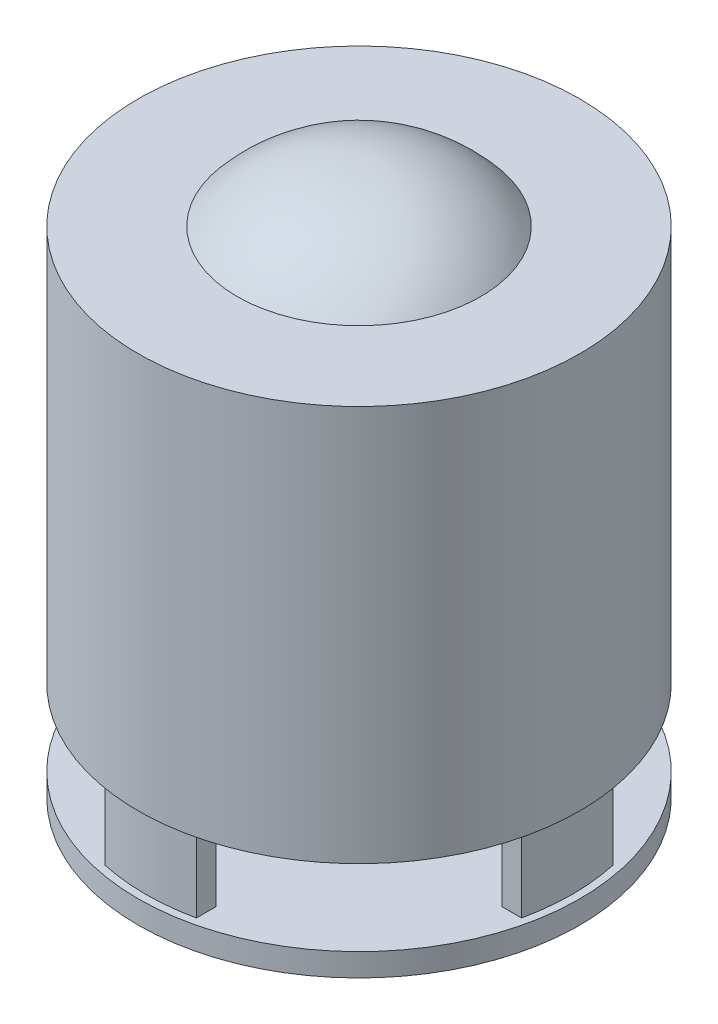
ISO-10303-21;
HEADER;
FILE_DESCRIPTION(('STEP AP214'),'2;1');
FILE_NAME('part.step','',(''),(''),'','','');
FILE_SCHEMA(('AUTOMOTIVE_DESIGN { 1 0 10303 214 1 1 1 1 }'));
ENDSEC;
DATA;
#1=APPLICATION_CONTEXT('core data for automotive mechanical design processes');
#2=APPLICATION_PROTOCOL_DEFINITION('international standard','automotive_design',2000,#1);
#3=PRODUCT_CONTEXT('',#1,'mechanical');
#4=PRODUCT('Part','Part','',(#3));
#5=PRODUCT_RELATED_PRODUCT_CATEGORY('part','',(#4));
#6=PRODUCT_DEFINITION_FORMATION('','',#4);
#7=PRODUCT_DEFINITION_CONTEXT('part definition',#1,'design');
#8=PRODUCT_DEFINITION('design','',#6,#7);
#9=PRODUCT_DEFINITION_SHAPE('','',#8);
#10=(LENGTH_UNIT() NAMED_UNIT(*) SI_UNIT(.MILLI.,.METRE.));
#11=(NAMED_UNIT(*) PLANE_ANGLE_UNIT() SI_UNIT($,.RADIAN.));
#12=(NAMED_UNIT(*) SI_UNIT($,.STERADIAN.) SOLID_ANGLE_UNIT());
#13=UNCERTAINTY_MEASURE_WITH_UNIT(LENGTH_MEASURE(1.E-05),#10,'distance_accuracy_value','');
#14=(GEOMETRIC_REPRESENTATION_CONTEXT(3) GLOBAL_UNCERTAINTY_ASSIGNED_CONTEXT((#13)) GLOBAL_UNIT_ASSIGNED_CONTEXT((#10,
#11,#12)) REPRESENTATION_CONTEXT('',''));
#15=CARTESIAN_POINT('',(0.,0.,0.));
#16=DIRECTION('',(0.,0.,1.));
#17=DIRECTION('',(1.,0.,0.));
#18=AXIS2_PLACEMENT_3D('',#15,#16,#17);
#19=CARTESIAN_POINT('',(0.,3.,0.));
#20=DIRECTION('',(0.,1.,0.));
#21=DIRECTION('',(0.,0.,1.));
#22=AXIS2_PLACEMENT_3D('',#19,#20,#21);
#23=PLANE('',#22);
#24=CARTESIAN_POINT('',(0.,3.,12.));
#25=DIRECTION('',(0.,1.,0.));
#26=DIRECTION('',(0.,0.,1.));
#27=AXIS2_PLACEMENT_3D('',#24,#25,#26);
#28=CIRCLE('',#27,2.05);
#29=CARTESIAN_POINT('',(0.,3.,14.05));
#30=VERTEX_POINT('',#29);
#31=EDGE_CURVE('E172',#30,#30,#28,.T.);
#32=ORIENTED_EDGE('',*,*,#31,.F.);
#33=EDGE_LOOP('',(#32));
#34=FACE_BOUND('',#33,.T.);
#35=CARTESIAN_POINT('',(10.3923048454132,3.,-6.0000000000002));
#36=DIRECTION('',(0.,1.,0.));
#37=DIRECTION('',(0.,0.,1.));
#38=AXIS2_PLACEMENT_3D('',#35,#36,#37);
#39=CIRCLE('',#38,2.05);
#40=CARTESIAN_POINT('',(10.3923048454132,3.,-3.9500000000002));
#41=VERTEX_POINT('',#40);
#42=EDGE_CURVE('E410',#41,#41,#39,.T.);
#43=ORIENTED_EDGE('',*,*,#42,.F.);
#44=EDGE_LOOP('',(#43));
#45=FACE_BOUND('',#44,.T.);
#46=CARTESIAN_POINT('',(-10.3923048454133,3.,-5.9999999999999));
#47=DIRECTION('',(0.,1.,0.));
#48=DIRECTION('',(0.,0.,1.));
#49=AXIS2_PLACEMENT_3D('',#46,#47,#48);
#50=CIRCLE('',#49,2.05);
#51=CARTESIAN_POINT('',(-10.3923048454133,3.,-3.9499999999999));
#52=VERTEX_POINT('',#51);
#53=EDGE_CURVE('E406',#52,#52,#50,.T.);
#54=ORIENTED_EDGE('',*,*,#53,.F.);
#55=EDGE_LOOP('',(#54));
#56=FACE_BOUND('',#55,.T.);
#57=CARTESIAN_POINT('',(0.,3.,0.));
#58=DIRECTION('',(0.,1.,0.));
#59=DIRECTION('',(0.,0.,1.));
#60=AXIS2_PLACEMENT_3D('',#57,#58,#59);
#61=CIRCLE('',#60,28.);
#62=CARTESIAN_POINT('',(-5.99999999999999,3.,27.3495886623547));
#63=VERTEX_POINT('',#62);
#64=CARTESIAN_POINT('',(6.00000000000001,3.,27.3495886623547));
#65=VERTEX_POINT('',#64);
#66=EDGE_CURVE('E52',#63,#65,#61,.T.);
#67=ORIENTED_EDGE('',*,*,#66,.F.);
#68=DIRECTION('',(0.,0.,1.));
#69=VECTOR('',#68,1.);
#70=CARTESIAN_POINT('',(-6.,3.,0.));
#71=LINE('',#70,#69);
#72=CARTESIAN_POINT('',(-5.99999999999999,3.,24.7840674627875));
#73=VERTEX_POINT('',#72);
#74=EDGE_CURVE('E166',#73,#63,#71,.T.);
#75=ORIENTED_EDGE('',*,*,#74,.F.);
#76=CARTESIAN_POINT('',(0.,3.,0.));
#77=DIRECTION('',(0.,1.,0.));
#78=DIRECTION('',(0.,0.,1.));
#79=AXIS2_PLACEMENT_3D('',#76,#77,#78);
#80=CIRCLE('',#79,25.5);
#81=CARTESIAN_POINT('',(6.00000000000001,3.,24.7840674627875));
#82=VERTEX_POINT('',#81);
#83=EDGE_CURVE('E180',#73,#82,#80,.T.);
#84=ORIENTED_EDGE('',*,*,#83,.T.);
#85=DIRECTION('',(0.,0.,1.));
#86=VECTOR('',#85,1.);
#87=CARTESIAN_POINT('',(6.,3.,0.));
#88=LINE('',#87,#86);
#89=EDGE_CURVE('E57',#82,#65,#88,.T.);
#90=ORIENTED_EDGE('',*,*,#89,.T.);
#91=EDGE_LOOP('',(#67,#75,#84,#90));
#92=FACE_BOUND('',#91,.T.);
#93=CARTESIAN_POINT('',(0.,3.,0.));
#94=DIRECTION('',(0.,1.,0.));
#95=DIRECTION('',(0.,0.,1.));
#96=AXIS2_PLACEMENT_3D('',#93,#94,#95);
#97=CIRCLE('',#96,28.);
#98=CARTESIAN_POINT('',(27.3495886623547,3.,6.));
#99=VERTEX_POINT('',#98);
#100=CARTESIAN_POINT('',(27.3495886623547,3.,-6.));
#101=VERTEX_POINT('',#100);
#102=EDGE_CURVE('E216',#99,#101,#97,.T.);
#103=ORIENTED_EDGE('',*,*,#102,.F.);
#104=DIRECTION('',(1.,0.,0.));
#105=VECTOR('',#104,1.);
#106=CARTESIAN_POINT('',(0.,3.,6.));
#107=LINE('',#106,#105);
#108=CARTESIAN_POINT('',(24.7840674627875,3.,6.));
#109=VERTEX_POINT('',#108);
#110=EDGE_CURVE('E201',#109,#99,#107,.T.);
#111=ORIENTED_EDGE('',*,*,#110,.F.);
#112=CARTESIAN_POINT('',(0.,3.,0.));
#113=DIRECTION('',(0.,1.,0.));
#114=DIRECTION('',(0.,0.,1.));
#115=AXIS2_PLACEMENT_3D('',#112,#113,#114);
#116=CIRCLE('',#115,25.5);
#117=CARTESIAN_POINT('',(24.7840674627875,3.,-6.));
#118=VERTEX_POINT('',#117);
#119=EDGE_CURVE('E205',#109,#118,#116,.T.);
#120=ORIENTED_EDGE('',*,*,#119,.T.);
#121=DIRECTION('',(1.,0.,0.));
#122=VECTOR('',#121,1.);
#123=CARTESIAN_POINT('',(0.,3.,-6.));
#124=LINE('',#123,#122);
#125=EDGE_CURVE('E219',#118,#101,#124,.T.);
#126=ORIENTED_EDGE('',*,*,#125,.T.);
#127=EDGE_LOOP('',(#103,#111,#120,#126));
#128=FACE_BOUND('',#127,.T.);
#129=DIRECTION('',(1.,0.,0.));
#130=VECTOR('',#129,1.);
#131=CARTESIAN_POINT('',(0.,3.,-6.));
#132=LINE('',#131,#130);
#133=CARTESIAN_POINT('',(-27.3495886623547,3.,-6.));
#134=VERTEX_POINT('',#133);
#135=CARTESIAN_POINT('',(-24.7840674627875,3.,-6.));
#136=VERTEX_POINT('',#135);
#137=EDGE_CURVE('E265',#134,#136,#132,.T.);
#138=ORIENTED_EDGE('',*,*,#137,.T.);
#139=CARTESIAN_POINT('',(0.,3.,0.));
#140=DIRECTION('',(0.,1.,0.));
#141=DIRECTION('',(0.,0.,1.));
#142=AXIS2_PLACEMENT_3D('',#139,#140,#141);
#143=CIRCLE('',#142,25.5);
#144=CARTESIAN_POINT('',(-24.7840674627875,3.,6.));
#145=VERTEX_POINT('',#144);
#146=EDGE_CURVE('E270',#136,#145,#143,.T.);
#147=ORIENTED_EDGE('',*,*,#146,.T.);
#148=DIRECTION('',(1.,0.,0.));
#149=VECTOR('',#148,1.);
#150=CARTESIAN_POINT('',(0.,3.,6.));
#151=LINE('',#150,#149);
#152=CARTESIAN_POINT('',(-27.3495886623547,3.,6.));
#153=VERTEX_POINT('',#152);
#154=EDGE_CURVE('E282',#153,#145,#151,.T.);
#155=ORIENTED_EDGE('',*,*,#154,.F.);
#156=CARTESIAN_POINT('',(0.,3.,0.));
#157=DIRECTION('',(0.,1.,0.));
#158=DIRECTION('',(0.,0.,1.));
#159=AXIS2_PLACEMENT_3D('',#156,#157,#158);
#160=CIRCLE('',#159,28.);
#161=EDGE_CURVE('E279',#134,#153,#160,.T.);
#162=ORIENTED_EDGE('',*,*,#161,.F.);
#163=EDGE_LOOP('',(#138,#147,#155,#162));
#164=FACE_BOUND('',#163,.T.);
#165=CARTESIAN_POINT('',(0.,3.,0.));
#166=DIRECTION('',(0.,1.,0.));
#167=DIRECTION('',(0.,0.,1.));
#168=AXIS2_PLACEMENT_3D('',#165,#166,#167);
#169=CIRCLE('',#168,29.);
#170=CARTESIAN_POINT('',(0.,3.,29.));
#171=VERTEX_POINT('',#170);
#172=EDGE_CURVE('E45',#171,#171,#169,.T.);
#173=ORIENTED_EDGE('',*,*,#172,.T.);
#174=EDGE_LOOP('',(#173));
#175=FACE_BOUND('',#174,.T.);
#176=DIRECTION('',(0.,0.,1.));
#177=VECTOR('',#176,1.);
#178=CARTESIAN_POINT('',(6.,3.,0.));
#179=LINE('',#178,#177);
#180=CARTESIAN_POINT('',(6.,3.,-27.3495886623547));
#181=VERTEX_POINT('',#180);
#182=CARTESIAN_POINT('',(6.,3.,-24.7840674627875));
#183=VERTEX_POINT('',#182);
#184=EDGE_CURVE('E233',#181,#183,#179,.T.);
#185=ORIENTED_EDGE('',*,*,#184,.T.);
#186=CARTESIAN_POINT('',(0.,3.,0.));
#187=DIRECTION('',(0.,1.,0.));
#188=DIRECTION('',(0.,0.,1.));
#189=AXIS2_PLACEMENT_3D('',#186,#187,#188);
#190=CIRCLE('',#189,25.5);
#191=CARTESIAN_POINT('',(-6.,3.,-24.7840674627875));
#192=VERTEX_POINT('',#191);
#193=EDGE_CURVE('E238',#183,#192,#190,.T.);
#194=ORIENTED_EDGE('',*,*,#193,.T.);
#195=DIRECTION('',(0.,0.,1.));
#196=VECTOR('',#195,1.);
#197=CARTESIAN_POINT('',(-6.,3.,0.));
#198=LINE('',#197,#196);
#199=CARTESIAN_POINT('',(-6.,3.,-27.3495886623547));
#200=VERTEX_POINT('',#199);
#201=EDGE_CURVE('E250',#200,#192,#198,.T.);
#202=ORIENTED_EDGE('',*,*,#201,.F.);
#203=CARTESIAN_POINT('',(0.,3.,0.));
#204=DIRECTION('',(0.,1.,0.));
#205=DIRECTION('',(0.,0.,1.));
#206=AXIS2_PLACEMENT_3D('',#203,#204,#205);
#207=CIRCLE('',#206,28.);
#208=EDGE_CURVE('E247',#181,#200,#207,.T.);
#209=ORIENTED_EDGE('',*,*,#208,.F.);
#210=EDGE_LOOP('',(#185,#194,#202,#209));
#211=FACE_BOUND('',#210,.T.);
#212=ADVANCED_FACE('F37',(#34,#45,#56,#92,#128,#164,#175,#211),#23,.T.);
#213=CARTESIAN_POINT('',(0.,3.,0.));
#214=DIRECTION('',(0.,-1.,0.));
#215=DIRECTION('',(0.,0.,-1.));
#216=AXIS2_PLACEMENT_3D('',#213,#214,#215);
#217=CYLINDRICAL_SURFACE('',#216,29.);
#218=ORIENTED_EDGE('',*,*,#172,.F.);
#219=EDGE_LOOP('',(#218));
#220=FACE_BOUND('',#219,.T.);
#221=CARTESIAN_POINT('',(0.,0.,0.));
#222=DIRECTION('',(0.,1.,0.));
#223=DIRECTION('',(0.,0.,1.));
#224=AXIS2_PLACEMENT_3D('',#221,#222,#223);
#225=CIRCLE('',#224,29.);
#226=CARTESIAN_POINT('',(0.,0.,29.));
#227=VERTEX_POINT('',#226);
#228=EDGE_CURVE('E297',#227,#227,#225,.T.);
#229=ORIENTED_EDGE('',*,*,#228,.T.);
#230=EDGE_LOOP('',(#229));
#231=FACE_BOUND('',#230,.T.);
#232=ADVANCED_FACE('F39',(#220,#231),#217,.T.);
#233=CARTESIAN_POINT('',(0.,0.,0.));
#234=DIRECTION('',(0.,1.,0.));
#235=DIRECTION('',(0.,0.,1.));
#236=AXIS2_PLACEMENT_3D('',#233,#234,#235);
#237=PLANE('',#236);
#238=CARTESIAN_POINT('',(0.,0.,12.));
#239=DIRECTION('',(0.,-1.,0.));
#240=DIRECTION('',(0.,0.,-1.));
#241=AXIS2_PLACEMENT_3D('',#238,#239,#240);
#242=CIRCLE('',#241,2.05);
#243=CARTESIAN_POINT('',(0.,0.,9.95));
#244=VERTEX_POINT('',#243);
#245=EDGE_CURVE('E405',#244,#244,#242,.T.);
#246=ORIENTED_EDGE('',*,*,#245,.F.);
#247=EDGE_LOOP('',(#246));
#248=FACE_BOUND('',#247,.T.);
#249=CARTESIAN_POINT('',(10.3923048454132,0.,-6.0000000000002));
#250=DIRECTION('',(0.,-1.,0.));
#251=DIRECTION('',(0.,0.,-1.));
#252=AXIS2_PLACEMENT_3D('',#249,#250,#251);
#253=CIRCLE('',#252,2.05);
#254=CARTESIAN_POINT('',(10.3923048454132,0.,-8.05000000000019));
#255=VERTEX_POINT('',#254);
#256=EDGE_CURVE('E407',#255,#255,#253,.T.);
#257=ORIENTED_EDGE('',*,*,#256,.F.);
#258=EDGE_LOOP('',(#257));
#259=FACE_BOUND('',#258,.T.);
#260=CARTESIAN_POINT('',(-10.3923048454133,0.,-5.9999999999999));
#261=DIRECTION('',(0.,-1.,0.));
#262=DIRECTION('',(0.,0.,-1.));
#263=AXIS2_PLACEMENT_3D('',#260,#261,#262);
#264=CIRCLE('',#263,2.05);
#265=CARTESIAN_POINT('',(-10.3923048454133,0.,-8.0499999999999));
#266=VERTEX_POINT('',#265);
#267=EDGE_CURVE('E413',#266,#266,#264,.T.);
#268=ORIENTED_EDGE('',*,*,#267,.F.);
#269=EDGE_LOOP('',(#268));
#270=FACE_BOUND('',#269,.T.);
#271=ORIENTED_EDGE('',*,*,#228,.F.);
#272=EDGE_LOOP('',(#271));
#273=FACE_BOUND('',#272,.T.);
#274=ADVANCED_FACE('F303',(#248,#259,#270,#273),#237,.F.);
#275=CARTESIAN_POINT('',(0.,13.,-6.));
#276=DIRECTION('',(0.,0.,-1.));
#277=DIRECTION('',(-1.,0.,0.));
#278=AXIS2_PLACEMENT_3D('',#275,#276,#277);
#279=PLANE('',#278);
#280=ORIENTED_EDGE('',*,*,#137,.F.);
#281=DIRECTION('',(0.,-1.,0.));
#282=VECTOR('',#281,1.);
#283=CARTESIAN_POINT('',(-27.3495886623547,13.,-6.));
#284=LINE('',#283,#282);
#285=CARTESIAN_POINT('',(-27.3495886623547,13.,-6.));
#286=VERTEX_POINT('',#285);
#287=EDGE_CURVE('E294',#286,#134,#284,.T.);
#288=ORIENTED_EDGE('',*,*,#287,.F.);
#289=DIRECTION('',(1.,0.,0.));
#290=VECTOR('',#289,1.);
#291=CARTESIAN_POINT('',(0.,13.,-6.));
#292=LINE('',#291,#290);
#293=CARTESIAN_POINT('',(-24.7840674627875,13.,-6.));
#294=VERTEX_POINT('',#293);
#295=EDGE_CURVE('E266',#286,#294,#292,.T.);
#296=ORIENTED_EDGE('',*,*,#295,.T.);
#297=DIRECTION('',(0.,-1.,0.));
#298=VECTOR('',#297,1.);
#299=CARTESIAN_POINT('',(-24.7840674627875,13.,-6.));
#300=LINE('',#299,#298);
#301=EDGE_CURVE('E277',#294,#136,#300,.T.);
#302=ORIENTED_EDGE('',*,*,#301,.T.);
#303=EDGE_LOOP('',(#280,#288,#296,#302));
#304=FACE_BOUND('',#303,.T.);
#305=ADVANCED_FACE('F305',(#304),#279,.T.);
#306=CARTESIAN_POINT('',(0.,13.,0.));
#307=DIRECTION('',(0.,-1.,0.));
#308=DIRECTION('',(0.,0.,-1.));
#309=AXIS2_PLACEMENT_3D('',#306,#307,#308);
#310=CYLINDRICAL_SURFACE('',#309,28.);
#311=ORIENTED_EDGE('',*,*,#161,.T.);
#312=DIRECTION('',(0.,-1.,0.));
#313=VECTOR('',#312,1.);
#314=CARTESIAN_POINT('',(-27.3495886623547,13.,6.));
#315=LINE('',#314,#313);
#316=CARTESIAN_POINT('',(-27.3495886623547,13.,6.));
#317=VERTEX_POINT('',#316);
#318=EDGE_CURVE('E291',#317,#153,#315,.T.);
#319=ORIENTED_EDGE('',*,*,#318,.F.);
#320=CARTESIAN_POINT('',(0.,13.,0.));
#321=DIRECTION('',(0.,1.,0.));
#322=DIRECTION('',(0.,0.,1.));
#323=AXIS2_PLACEMENT_3D('',#320,#321,#322);
#324=CIRCLE('',#323,28.);
#325=EDGE_CURVE('E269',#286,#317,#324,.T.);
#326=ORIENTED_EDGE('',*,*,#325,.F.);
#327=ORIENTED_EDGE('',*,*,#287,.T.);
#328=EDGE_LOOP('',(#311,#319,#326,#327));
#329=FACE_BOUND('',#328,.T.);
#330=ADVANCED_FACE('F311',(#329),#310,.T.);
#331=CARTESIAN_POINT('',(0.,13.,6.));
#332=DIRECTION('',(0.,0.,-1.));
#333=DIRECTION('',(-1.,0.,0.));
#334=AXIS2_PLACEMENT_3D('',#331,#332,#333);
#335=PLANE('',#334);
#336=ORIENTED_EDGE('',*,*,#154,.T.);
#337=DIRECTION('',(0.,-1.,0.));
#338=VECTOR('',#337,1.);
#339=CARTESIAN_POINT('',(-24.7840674627875,13.,6.));
#340=LINE('',#339,#338);
#341=CARTESIAN_POINT('',(-24.7840674627875,13.,6.));
#342=VERTEX_POINT('',#341);
#343=EDGE_CURVE('E288',#342,#145,#340,.T.);
#344=ORIENTED_EDGE('',*,*,#343,.F.);
#345=DIRECTION('',(1.,0.,0.));
#346=VECTOR('',#345,1.);
#347=CARTESIAN_POINT('',(0.,13.,6.));
#348=LINE('',#347,#346);
#349=EDGE_CURVE('E272',#317,#342,#348,.T.);
#350=ORIENTED_EDGE('',*,*,#349,.F.);
#351=ORIENTED_EDGE('',*,*,#318,.T.);
#352=EDGE_LOOP('',(#336,#344,#350,#351));
#353=FACE_BOUND('',#352,.T.);
#354=ADVANCED_FACE('F327',(#353),#335,.F.);
#355=CARTESIAN_POINT('',(0.,13.,0.));
#356=DIRECTION('',(0.,-1.,0.));
#357=DIRECTION('',(0.,0.,-1.));
#358=AXIS2_PLACEMENT_3D('',#355,#356,#357);
#359=CYLINDRICAL_SURFACE('',#358,25.5);
#360=ORIENTED_EDGE('',*,*,#146,.F.);
#361=ORIENTED_EDGE('',*,*,#301,.F.);
#362=CARTESIAN_POINT('',(0.,13.,0.));
#363=DIRECTION('',(0.,1.,0.));
#364=DIRECTION('',(0.,0.,1.));
#365=AXIS2_PLACEMENT_3D('',#362,#363,#364);
#366=CIRCLE('',#365,25.5);
#367=EDGE_CURVE('E274',#294,#342,#366,.T.);
#368=ORIENTED_EDGE('',*,*,#367,.T.);
#369=ORIENTED_EDGE('',*,*,#343,.T.);
#370=EDGE_LOOP('',(#360,#361,#368,#369));
#371=FACE_BOUND('',#370,.T.);
#372=ADVANCED_FACE('F331',(#371),#359,.F.);
#373=CARTESIAN_POINT('',(6.,13.,0.));
#374=DIRECTION('',(1.,0.,0.));
#375=DIRECTION('',(0.,0.,-1.));
#376=AXIS2_PLACEMENT_3D('',#373,#374,#375);
#377=PLANE('',#376);
#378=ORIENTED_EDGE('',*,*,#184,.F.);
#379=DIRECTION('',(0.,-1.,0.));
#380=VECTOR('',#379,1.);
#381=CARTESIAN_POINT('',(6.,13.,-27.3495886623547));
#382=LINE('',#381,#380);
#383=CARTESIAN_POINT('',(6.,13.,-27.3495886623547));
#384=VERTEX_POINT('',#383);
#385=EDGE_CURVE('E262',#384,#181,#382,.T.);
#386=ORIENTED_EDGE('',*,*,#385,.F.);
#387=DIRECTION('',(0.,0.,1.));
#388=VECTOR('',#387,1.);
#389=CARTESIAN_POINT('',(6.,13.,0.));
#390=LINE('',#389,#388);
#391=CARTESIAN_POINT('',(6.,13.,-24.7840674627875));
#392=VERTEX_POINT('',#391);
#393=EDGE_CURVE('E234',#384,#392,#390,.T.);
#394=ORIENTED_EDGE('',*,*,#393,.T.);
#395=DIRECTION('',(0.,-1.,0.));
#396=VECTOR('',#395,1.);
#397=CARTESIAN_POINT('',(6.,13.,-24.7840674627875));
#398=LINE('',#397,#396);
#399=EDGE_CURVE('E245',#392,#183,#398,.T.);
#400=ORIENTED_EDGE('',*,*,#399,.T.);
#401=EDGE_LOOP('',(#378,#386,#394,#400));
#402=FACE_BOUND('',#401,.T.);
#403=ADVANCED_FACE('F335',(#402),#377,.T.);
#404=CARTESIAN_POINT('',(0.,13.,0.));
#405=DIRECTION('',(0.,-1.,0.));
#406=DIRECTION('',(0.,0.,-1.));
#407=AXIS2_PLACEMENT_3D('',#404,#405,#406);
#408=CYLINDRICAL_SURFACE('',#407,28.);
#409=ORIENTED_EDGE('',*,*,#208,.T.);
#410=DIRECTION('',(0.,-1.,0.));
#411=VECTOR('',#410,1.);
#412=CARTESIAN_POINT('',(-6.,13.,-27.3495886623547));
#413=LINE('',#412,#411);
#414=CARTESIAN_POINT('',(-6.,13.,-27.3495886623547));
#415=VERTEX_POINT('',#414);
#416=EDGE_CURVE('E259',#415,#200,#413,.T.);
#417=ORIENTED_EDGE('',*,*,#416,.F.);
#418=CARTESIAN_POINT('',(0.,13.,0.));
#419=DIRECTION('',(0.,1.,0.));
#420=DIRECTION('',(0.,0.,1.));
#421=AXIS2_PLACEMENT_3D('',#418,#419,#420);
#422=CIRCLE('',#421,28.);
#423=EDGE_CURVE('E237',#384,#415,#422,.T.);
#424=ORIENTED_EDGE('',*,*,#423,.F.);
#425=ORIENTED_EDGE('',*,*,#385,.T.);
#426=EDGE_LOOP('',(#409,#417,#424,#425));
#427=FACE_BOUND('',#426,.T.);
#428=ADVANCED_FACE('F339',(#427),#408,.T.);
#429=CARTESIAN_POINT('',(-6.,13.,0.));
#430=DIRECTION('',(1.,0.,0.));
#431=DIRECTION('',(0.,0.,-1.));
#432=AXIS2_PLACEMENT_3D('',#429,#430,#431);
#433=PLANE('',#432);
#434=ORIENTED_EDGE('',*,*,#201,.T.);
#435=DIRECTION('',(0.,-1.,0.));
#436=VECTOR('',#435,1.);
#437=CARTESIAN_POINT('',(-6.,13.,-24.7840674627875));
#438=LINE('',#437,#436);
#439=CARTESIAN_POINT('',(-6.,13.,-24.7840674627875));
#440=VERTEX_POINT('',#439);
#441=EDGE_CURVE('E256',#440,#192,#438,.T.);
#442=ORIENTED_EDGE('',*,*,#441,.F.);
#443=DIRECTION('',(0.,0.,1.));
#444=VECTOR('',#443,1.);
#445=CARTESIAN_POINT('',(-6.,13.,0.));
#446=LINE('',#445,#444);
#447=EDGE_CURVE('E240',#415,#440,#446,.T.);
#448=ORIENTED_EDGE('',*,*,#447,.F.);
#449=ORIENTED_EDGE('',*,*,#416,.T.);
#450=EDGE_LOOP('',(#434,#442,#448,#449));
#451=FACE_BOUND('',#450,.T.);
#452=ADVANCED_FACE('F343',(#451),#433,.F.);
#453=CARTESIAN_POINT('',(0.,13.,0.));
#454=DIRECTION('',(0.,-1.,0.));
#455=DIRECTION('',(0.,0.,-1.));
#456=AXIS2_PLACEMENT_3D('',#453,#454,#455);
#457=CYLINDRICAL_SURFACE('',#456,25.5);
#458=ORIENTED_EDGE('',*,*,#193,.F.);
#459=ORIENTED_EDGE('',*,*,#399,.F.);
#460=CARTESIAN_POINT('',(0.,13.,0.));
#461=DIRECTION('',(0.,1.,0.));
#462=DIRECTION('',(0.,0.,1.));
#463=AXIS2_PLACEMENT_3D('',#460,#461,#462);
#464=CIRCLE('',#463,25.5);
#465=EDGE_CURVE('E242',#392,#440,#464,.T.);
#466=ORIENTED_EDGE('',*,*,#465,.T.);
#467=ORIENTED_EDGE('',*,*,#441,.T.);
#468=EDGE_LOOP('',(#458,#459,#466,#467));
#469=FACE_BOUND('',#468,.T.);
#470=ADVANCED_FACE('F347',(#469),#457,.F.);
#471=CARTESIAN_POINT('',(0.,13.,6.));
#472=DIRECTION('',(0.,0.,-1.));
#473=DIRECTION('',(-1.,0.,0.));
#474=AXIS2_PLACEMENT_3D('',#471,#472,#473);
#475=PLANE('',#474);
#476=ORIENTED_EDGE('',*,*,#110,.T.);
#477=DIRECTION('',(0.,-1.,0.));
#478=VECTOR('',#477,1.);
#479=CARTESIAN_POINT('',(27.3495886623547,13.,6.));
#480=LINE('',#479,#478);
#481=CARTESIAN_POINT('',(27.3495886623547,13.,6.));
#482=VERTEX_POINT('',#481);
#483=EDGE_CURVE('E230',#482,#99,#480,.T.);
#484=ORIENTED_EDGE('',*,*,#483,.F.);
#485=DIRECTION('',(1.,0.,0.));
#486=VECTOR('',#485,1.);
#487=CARTESIAN_POINT('',(0.,13.,6.));
#488=LINE('',#487,#486);
#489=CARTESIAN_POINT('',(24.7840674627875,13.,6.));
#490=VERTEX_POINT('',#489);
#491=EDGE_CURVE('E202',#490,#482,#488,.T.);
#492=ORIENTED_EDGE('',*,*,#491,.F.);
#493=DIRECTION('',(0.,-1.,0.));
#494=VECTOR('',#493,1.);
#495=CARTESIAN_POINT('',(24.7840674627875,13.,6.));
#496=LINE('',#495,#494);
#497=EDGE_CURVE('E213',#490,#109,#496,.T.);
#498=ORIENTED_EDGE('',*,*,#497,.T.);
#499=EDGE_LOOP('',(#476,#484,#492,#498));
#500=FACE_BOUND('',#499,.T.);
#501=ADVANCED_FACE('F351',(#500),#475,.F.);
#502=CARTESIAN_POINT('',(0.,13.,0.));
#503=DIRECTION('',(0.,-1.,0.));
#504=DIRECTION('',(0.,0.,-1.));
#505=AXIS2_PLACEMENT_3D('',#502,#503,#504);
#506=CYLINDRICAL_SURFACE('',#505,28.);
#507=ORIENTED_EDGE('',*,*,#102,.T.);
#508=DIRECTION('',(0.,-1.,0.));
#509=VECTOR('',#508,1.);
#510=CARTESIAN_POINT('',(27.3495886623547,13.,-6.));
#511=LINE('',#510,#509);
#512=CARTESIAN_POINT('',(27.3495886623547,13.,-6.));
#513=VERTEX_POINT('',#512);
#514=EDGE_CURVE('E227',#513,#101,#511,.T.);
#515=ORIENTED_EDGE('',*,*,#514,.F.);
#516=CARTESIAN_POINT('',(0.,13.,0.));
#517=DIRECTION('',(0.,1.,0.));
#518=DIRECTION('',(0.,0.,1.));
#519=AXIS2_PLACEMENT_3D('',#516,#517,#518);
#520=CIRCLE('',#519,28.);
#521=EDGE_CURVE('E204',#482,#513,#520,.T.);
#522=ORIENTED_EDGE('',*,*,#521,.F.);
#523=ORIENTED_EDGE('',*,*,#483,.T.);
#524=EDGE_LOOP('',(#507,#515,#522,#523));
#525=FACE_BOUND('',#524,.T.);
#526=ADVANCED_FACE('F355',(#525),#506,.T.);
#527=CARTESIAN_POINT('',(0.,13.,-6.));
#528=DIRECTION('',(0.,0.,-1.));
#529=DIRECTION('',(-1.,0.,0.));
#530=AXIS2_PLACEMENT_3D('',#527,#528,#529);
#531=PLANE('',#530);
#532=ORIENTED_EDGE('',*,*,#125,.F.);
#533=DIRECTION('',(0.,-1.,0.));
#534=VECTOR('',#533,1.);
#535=CARTESIAN_POINT('',(24.7840674627875,13.,-6.));
#536=LINE('',#535,#534);
#537=CARTESIAN_POINT('',(24.7840674627875,13.,-6.));
#538=VERTEX_POINT('',#537);
#539=EDGE_CURVE('E224',#538,#118,#536,.T.);
#540=ORIENTED_EDGE('',*,*,#539,.F.);
#541=DIRECTION('',(1.,0.,0.));
#542=VECTOR('',#541,1.);
#543=CARTESIAN_POINT('',(0.,13.,-6.));
#544=LINE('',#543,#542);
#545=EDGE_CURVE('E207',#538,#513,#544,.T.);
#546=ORIENTED_EDGE('',*,*,#545,.T.);
#547=ORIENTED_EDGE('',*,*,#514,.T.);
#548=EDGE_LOOP('',(#532,#540,#546,#547));
#549=FACE_BOUND('',#548,.T.);
#550=ADVANCED_FACE('F359',(#549),#531,.T.);
#551=CARTESIAN_POINT('',(0.,13.,0.));
#552=DIRECTION('',(0.,-1.,0.));
#553=DIRECTION('',(0.,0.,-1.));
#554=AXIS2_PLACEMENT_3D('',#551,#552,#553);
#555=CYLINDRICAL_SURFACE('',#554,25.5);
#556=ORIENTED_EDGE('',*,*,#119,.F.);
#557=ORIENTED_EDGE('',*,*,#497,.F.);
#558=CARTESIAN_POINT('',(0.,13.,0.));
#559=DIRECTION('',(0.,1.,0.));
#560=DIRECTION('',(0.,0.,1.));
#561=AXIS2_PLACEMENT_3D('',#558,#559,#560);
#562=CIRCLE('',#561,25.5);
#563=EDGE_CURVE('E210',#490,#538,#562,.T.);
#564=ORIENTED_EDGE('',*,*,#563,.T.);
#565=ORIENTED_EDGE('',*,*,#539,.T.);
#566=EDGE_LOOP('',(#556,#557,#564,#565));
#567=FACE_BOUND('',#566,.T.);
#568=ADVANCED_FACE('F363',(#567),#555,.F.);
#569=CARTESIAN_POINT('',(-6.,13.,0.));
#570=DIRECTION('',(1.,0.,0.));
#571=DIRECTION('',(0.,0.,-1.));
#572=AXIS2_PLACEMENT_3D('',#569,#570,#571);
#573=PLANE('',#572);
#574=ORIENTED_EDGE('',*,*,#74,.T.);
#575=DIRECTION('',(0.,-1.,0.));
#576=VECTOR('',#575,1.);
#577=CARTESIAN_POINT('',(-5.99999999999999,13.,27.3495886623547));
#578=LINE('',#577,#576);
#579=CARTESIAN_POINT('',(-5.99999999999999,13.,27.3495886623547));
#580=VERTEX_POINT('',#579);
#581=EDGE_CURVE('E199',#580,#63,#578,.T.);
#582=ORIENTED_EDGE('',*,*,#581,.F.);
#583=DIRECTION('',(0.,0.,1.));
#584=VECTOR('',#583,1.);
#585=CARTESIAN_POINT('',(-6.,13.,0.));
#586=LINE('',#585,#584);
#587=CARTESIAN_POINT('',(-5.99999999999999,13.,24.7840674627875));
#588=VERTEX_POINT('',#587);
#589=EDGE_CURVE('E177',#588,#580,#586,.T.);
#590=ORIENTED_EDGE('',*,*,#589,.F.);
#591=DIRECTION('',(0.,-1.,0.));
#592=VECTOR('',#591,1.);
#593=CARTESIAN_POINT('',(-5.99999999999999,13.,24.7840674627875));
#594=LINE('',#593,#592);
#595=EDGE_CURVE('E187',#588,#73,#594,.T.);
#596=ORIENTED_EDGE('',*,*,#595,.T.);
#597=EDGE_LOOP('',(#574,#582,#590,#596));
#598=FACE_BOUND('',#597,.T.);
#599=ADVANCED_FACE('F367',(#598),#573,.F.);
#600=CARTESIAN_POINT('',(0.,13.,0.));
#601=DIRECTION('',(0.,-1.,0.));
#602=DIRECTION('',(0.,0.,-1.));
#603=AXIS2_PLACEMENT_3D('',#600,#601,#602);
#604=CYLINDRICAL_SURFACE('',#603,28.);
#605=ORIENTED_EDGE('',*,*,#66,.T.);
#606=DIRECTION('',(0.,-1.,0.));
#607=VECTOR('',#606,1.);
#608=CARTESIAN_POINT('',(6.00000000000001,13.,27.3495886623547));
#609=LINE('',#608,#607);
#610=CARTESIAN_POINT('',(6.00000000000001,13.,27.3495886623547));
#611=VERTEX_POINT('',#610);
#612=EDGE_CURVE('E197',#611,#65,#609,.T.);
#613=ORIENTED_EDGE('',*,*,#612,.F.);
#614=CARTESIAN_POINT('',(0.,13.,0.));
#615=DIRECTION('',(0.,1.,0.));
#616=DIRECTION('',(0.,0.,1.));
#617=AXIS2_PLACEMENT_3D('',#614,#615,#616);
#618=CIRCLE('',#617,28.);
#619=EDGE_CURVE('E179',#580,#611,#618,.T.);
#620=ORIENTED_EDGE('',*,*,#619,.F.);
#621=ORIENTED_EDGE('',*,*,#581,.T.);
#622=EDGE_LOOP('',(#605,#613,#620,#621));
#623=FACE_BOUND('',#622,.T.);
#624=ADVANCED_FACE('F371',(#623),#604,.T.);
#625=CARTESIAN_POINT('',(6.,13.,0.));
#626=DIRECTION('',(1.,0.,0.));
#627=DIRECTION('',(0.,0.,-1.));
#628=AXIS2_PLACEMENT_3D('',#625,#626,#627);
#629=PLANE('',#628);
#630=ORIENTED_EDGE('',*,*,#89,.F.);
#631=DIRECTION('',(0.,-1.,0.));
#632=VECTOR('',#631,1.);
#633=CARTESIAN_POINT('',(6.00000000000001,13.,24.7840674627875));
#634=LINE('',#633,#632);
#635=CARTESIAN_POINT('',(6.00000000000001,13.,24.7840674627875));
#636=VERTEX_POINT('',#635);
#637=EDGE_CURVE('E194',#636,#82,#634,.T.);
#638=ORIENTED_EDGE('',*,*,#637,.F.);
#639=DIRECTION('',(0.,0.,1.));
#640=VECTOR('',#639,1.);
#641=CARTESIAN_POINT('',(6.,13.,0.));
#642=LINE('',#641,#640);
#643=EDGE_CURVE('E182',#636,#611,#642,.T.);
#644=ORIENTED_EDGE('',*,*,#643,.T.);
#645=ORIENTED_EDGE('',*,*,#612,.T.);
#646=EDGE_LOOP('',(#630,#638,#644,#645));
#647=FACE_BOUND('',#646,.T.);
#648=ADVANCED_FACE('F375',(#647),#629,.T.);
#649=CARTESIAN_POINT('',(0.,13.,0.));
#650=DIRECTION('',(0.,-1.,0.));
#651=DIRECTION('',(0.,0.,-1.));
#652=AXIS2_PLACEMENT_3D('',#649,#650,#651);
#653=CYLINDRICAL_SURFACE('',#652,25.5);
#654=ORIENTED_EDGE('',*,*,#83,.F.);
#655=ORIENTED_EDGE('',*,*,#595,.F.);
#656=CARTESIAN_POINT('',(0.,13.,0.));
#657=DIRECTION('',(0.,1.,0.));
#658=DIRECTION('',(0.,0.,1.));
#659=AXIS2_PLACEMENT_3D('',#656,#657,#658);
#660=CIRCLE('',#659,25.5);
#661=EDGE_CURVE('E185',#588,#636,#660,.T.);
#662=ORIENTED_EDGE('',*,*,#661,.T.);
#663=ORIENTED_EDGE('',*,*,#637,.T.);
#664=EDGE_LOOP('',(#654,#655,#662,#663));
#665=FACE_BOUND('',#664,.T.);
#666=ADVANCED_FACE('F379',(#665),#653,.F.);
#667=CARTESIAN_POINT('',(0.,13.,0.));
#668=DIRECTION('',(0.,1.,0.));
#669=DIRECTION('',(0.,0.,1.));
#670=AXIS2_PLACEMENT_3D('',#667,#668,#669);
#671=PLANE('',#670);
#672=ORIENTED_EDGE('',*,*,#393,.F.);
#673=ORIENTED_EDGE('',*,*,#423,.T.);
#674=ORIENTED_EDGE('',*,*,#447,.T.);
#675=ORIENTED_EDGE('',*,*,#465,.F.);
#676=EDGE_LOOP('',(#672,#673,#674,#675));
#677=FACE_BOUND('',#676,.T.);
#678=ORIENTED_EDGE('',*,*,#563,.F.);
#679=ORIENTED_EDGE('',*,*,#491,.T.);
#680=ORIENTED_EDGE('',*,*,#521,.T.);
#681=ORIENTED_EDGE('',*,*,#545,.F.);
#682=EDGE_LOOP('',(#678,#679,#680,#681));
#683=FACE_BOUND('',#682,.T.);
#684=ORIENTED_EDGE('',*,*,#661,.F.);
#685=ORIENTED_EDGE('',*,*,#589,.T.);
#686=ORIENTED_EDGE('',*,*,#619,.T.);
#687=ORIENTED_EDGE('',*,*,#643,.F.);
#688=EDGE_LOOP('',(#684,#685,#686,#687));
#689=FACE_BOUND('',#688,.T.);
#690=CARTESIAN_POINT('',(0.,13.,0.));
#691=DIRECTION('',(0.,1.,0.));
#692=DIRECTION('',(0.,0.,1.));
#693=AXIS2_PLACEMENT_3D('',#690,#691,#692);
#694=CIRCLE('',#693,29.);
#695=CARTESIAN_POINT('',(0.,13.,-29.));
#696=VERTEX_POINT('',#695);
#697=EDGE_CURVE('E167',#696,#696,#694,.T.);
#698=ORIENTED_EDGE('',*,*,#697,.F.);
#699=EDGE_LOOP('',(#698));
#700=FACE_BOUND('',#699,.T.);
#701=ORIENTED_EDGE('',*,*,#295,.F.);
#702=ORIENTED_EDGE('',*,*,#325,.T.);
#703=ORIENTED_EDGE('',*,*,#349,.T.);
#704=ORIENTED_EDGE('',*,*,#367,.F.);
#705=EDGE_LOOP('',(#701,#702,#703,#704));
#706=FACE_BOUND('',#705,.T.);
#707=ADVANCED_FACE('F383',(#677,#683,#689,#700,#706),#671,.F.);
#708=CARTESIAN_POINT('',(0.,65.,0.));
#709=DIRECTION('',(0.,-1.,0.));
#710=DIRECTION('',(0.,0.,-1.));
#711=AXIS2_PLACEMENT_3D('',#708,#709,#710);
#712=CYLINDRICAL_SURFACE('',#711,29.);
#713=CARTESIAN_POINT('',(0.,65.,0.));
#714=DIRECTION('',(0.,1.,0.));
#715=DIRECTION('',(0.,0.,1.));
#716=AXIS2_PLACEMENT_3D('',#713,#714,#715);
#717=CIRCLE('',#716,29.);
#718=CARTESIAN_POINT('',(0.,65.,-29.));
#719=VERTEX_POINT('',#718);
#720=EDGE_CURVE('E164',#719,#719,#717,.T.);
#721=CARTESIAN_POINT('',(0.,65.,-29.));
#722=CARTESIAN_POINT('',(0.,64.4583333333333,-29.));
#723=CARTESIAN_POINT('',(0.,63.9166666666667,-29.));
#724=CARTESIAN_POINT('',(0.,62.8333333333333,-29.));
#725=CARTESIAN_POINT('',(0.,62.2916666666667,-29.));
#726=CARTESIAN_POINT('',(0.,61.2083333333333,-29.));
#727=CARTESIAN_POINT('',(0.,60.6666666666667,-29.));
#728=CARTESIAN_POINT('',(0.,59.5833333333333,-29.));
#729=CARTESIAN_POINT('',(0.,59.0416666666667,-29.));
#730=CARTESIAN_POINT('',(0.,57.9583333333333,-29.));
#731=CARTESIAN_POINT('',(0.,57.4166666666667,-29.));
#732=CARTESIAN_POINT('',(0.,56.3333333333333,-29.));
#733=CARTESIAN_POINT('',(0.,55.7916666666667,-29.));
#734=CARTESIAN_POINT('',(0.,54.7083333333333,-29.));
#735=CARTESIAN_POINT('',(0.,54.1666666666667,-29.));
#736=CARTESIAN_POINT('',(0.,53.0833333333333,-29.));
#737=CARTESIAN_POINT('',(0.,52.5416666666667,-29.));
#738=CARTESIAN_POINT('',(0.,51.4583333333333,-29.));
#739=CARTESIAN_POINT('',(0.,50.9166666666667,-29.));
#740=CARTESIAN_POINT('',(0.,49.8333333333333,-29.));
#741=CARTESIAN_POINT('',(0.,49.2916666666667,-29.));
#742=CARTESIAN_POINT('',(0.,48.2083333333333,-29.));
#743=CARTESIAN_POINT('',(0.,47.6666666666667,-29.));
#744=CARTESIAN_POINT('',(0.,46.5833333333333,-29.));
#745=CARTESIAN_POINT('',(0.,46.0416666666667,-29.));
#746=CARTESIAN_POINT('',(0.,44.9583333333333,-29.));
#747=CARTESIAN_POINT('',(0.,44.4166666666667,-29.));
#748=CARTESIAN_POINT('',(0.,43.3333333333333,-29.));
#749=CARTESIAN_POINT('',(0.,42.7916666666667,-29.));
#750=CARTESIAN_POINT('',(0.,41.7083333333333,-29.));
#751=CARTESIAN_POINT('',(0.,41.1666666666667,-29.));
#752=CARTESIAN_POINT('',(0.,40.0833333333333,-29.));
#753=CARTESIAN_POINT('',(0.,39.5416666666667,-29.));
#754=CARTESIAN_POINT('',(0.,38.4583333333333,-29.));
#755=CARTESIAN_POINT('',(0.,37.9166666666667,-29.));
#756=CARTESIAN_POINT('',(0.,36.8333333333333,-29.));
#757=CARTESIAN_POINT('',(0.,36.2916666666667,-29.));
#758=CARTESIAN_POINT('',(0.,35.2083333333333,-29.));
#759=CARTESIAN_POINT('',(0.,34.6666666666667,-29.));
#760=CARTESIAN_POINT('',(0.,33.5833333333333,-29.));
#761=CARTESIAN_POINT('',(0.,33.0416666666667,-29.));
#762=CARTESIAN_POINT('',(0.,31.9583333333333,-29.));
#763=CARTESIAN_POINT('',(0.,31.4166666666667,-29.));
#764=CARTESIAN_POINT('',(0.,30.3333333333333,-29.));
#765=CARTESIAN_POINT('',(0.,29.7916666666667,-29.));
#766=CARTESIAN_POINT('',(0.,28.7083333333333,-29.));
#767=CARTESIAN_POINT('',(0.,28.1666666666667,-29.));
#768=CARTESIAN_POINT('',(0.,27.0833333333333,-29.));
#769=CARTESIAN_POINT('',(0.,26.5416666666667,-29.));
#770=CARTESIAN_POINT('',(0.,25.4583333333333,-29.));
#771=CARTESIAN_POINT('',(0.,24.9166666666667,-29.));
#772=CARTESIAN_POINT('',(0.,23.8333333333333,-29.));
#773=CARTESIAN_POINT('',(0.,23.2916666666667,-29.));
#774=CARTESIAN_POINT('',(0.,22.2083333333333,-29.));
#775=CARTESIAN_POINT('',(0.,21.6666666666667,-29.));
#776=CARTESIAN_POINT('',(0.,20.5833333333333,-29.));
#777=CARTESIAN_POINT('',(0.,20.0416666666667,-29.));
#778=CARTESIAN_POINT('',(0.,18.9583333333333,-29.));
#779=CARTESIAN_POINT('',(0.,18.4166666666667,-29.));
#780=CARTESIAN_POINT('',(0.,17.3333333333333,-29.));
#781=CARTESIAN_POINT('',(0.,16.7916666666667,-29.));
#782=CARTESIAN_POINT('',(0.,15.7083333333333,-29.));
#783=CARTESIAN_POINT('',(0.,15.1666666666667,-29.));
#784=CARTESIAN_POINT('',(0.,14.0833333333333,-29.));
#785=CARTESIAN_POINT('',(0.,13.5416666666667,-29.));
#786=CARTESIAN_POINT('',(0.,13.,-29.));
#787=B_SPLINE_CURVE_WITH_KNOTS('',3,(#721,#722,#723,#724,#725,#726,#727,#728,#729,#730,#731,
#732,#733,#734,#735,#736,#737,#738,#739,#740,#741,#742,#743,#744,#745,#746,#747,#748,#749,#750,
#751,#752,#753,#754,#755,#756,#757,#758,#759,#760,#761,#762,#763,#764,#765,#766,#767,#768,#769,
#770,#771,#772,#773,#774,#775,#776,#777,#778,#779,#780,#781,#782,#783,#784,#785,#786),
.UNSPECIFIED.,.F.,.F.,(4,2,2,2,2,2,2,2,2,2,2,2,2,2,2,2,2,2,2,2,2,2,2,2,2,2,2,2,2,2,2,2,4),(0.,
1.62499999999999,3.24999999999999,4.87499999999999,6.49999999999999,8.12499999999999,
9.74999999999999,11.375,13.,14.625,16.25,17.875,19.5,21.125,22.75,24.375,26.,27.625,29.25,
30.875,32.5,34.125,35.75,37.375,39.,40.625,42.25,43.875,45.5,47.125,48.75,50.375,52.),.UNSPECIFIED.);
#788=EDGE_CURVE('BSEAM160',#719,#696,#787,.T.);
#789=ORIENTED_EDGE('',*,*,#720,.F.);
#790=ORIENTED_EDGE('',*,*,#697,.T.);
#791=ORIENTED_EDGE('',*,*,#788,.T.);
#792=ORIENTED_EDGE('',*,*,#788,.F.);
#793=EDGE_LOOP('',(#789,#791,#790,#792));
#794=FACE_BOUND('',#793,.T.);
#795=ADVANCED_FACE('F160',(#794),#712,.T.);
#796=CARTESIAN_POINT('',(0.,65.,0.));
#797=DIRECTION('',(0.,1.,0.));
#798=DIRECTION('',(0.,0.,1.));
#799=AXIS2_PLACEMENT_3D('',#796,#797,#798);
#800=PLANE('',#799);
#801=CARTESIAN_POINT('',(0.,65.,0.));
#802=DIRECTION('',(0.,1.,0.));
#803=DIRECTION('',(0.,0.,1.));
#804=AXIS2_PLACEMENT_3D('',#801,#802,#803);
#805=CIRCLE('',#804,16.);
#806=CARTESIAN_POINT('',(0.,65.,16.));
#807=VERTEX_POINT('',#806);
#808=EDGE_CURVE('E11',#807,#807,#805,.T.);
#809=ORIENTED_EDGE('',*,*,#808,.F.);
#810=EDGE_LOOP('',(#809));
#811=FACE_BOUND('',#810,.T.);
#812=ORIENTED_EDGE('',*,*,#720,.T.);
#813=EDGE_LOOP('',(#812));
#814=FACE_BOUND('',#813,.T.);
#815=ADVANCED_FACE('F154',(#811,#814),#800,.T.);
#816=CARTESIAN_POINT('',(0.,52.0155314032259,-0.788044988911308));
#817=DIRECTION('',(-1.,0.,0.));
#818=DIRECTION('',(0.,0.,-1.));
#819=AXIS2_PLACEMENT_3D('',#816,#817,#818);
#820=CIRCLE('',#819,20.);
#821=TRIMMED_CURVE('',#820,(PARAMETER_VALUE(-1.61020877894685)),
(PARAMETER_VALUE(1.61020877894685)),.T.,.PARAMETER.);
#822=CARTESIAN_POINT('',(0.,52.0155314032259,0.));
#823=DIRECTION('',(0.,-1.,0.));
#824=AXIS1_PLACEMENT('',#822,#823);
#825=SURFACE_OF_REVOLUTION('',#821,#824);
#826=CARTESIAN_POINT('',(0.,72.,0.));
#827=VERTEX_POINT('',#826);
#828=VERTEX_LOOP('',#827);
#829=FACE_BOUND('',#828,.T.);
#830=ORIENTED_EDGE('',*,*,#808,.T.);
#831=EDGE_LOOP('',(#830));
#832=FACE_BOUND('',#831,.T.);
#833=ADVANCED_FACE('F150',(#829,#832),#825,.T.);
#834=CARTESIAN_POINT('',(-10.3923048454133,5.,-5.9999999999999));
#835=DIRECTION('',(0.,-1.,0.));
#836=DIRECTION('',(0.,0.,-1.));
#837=AXIS2_PLACEMENT_3D('',#834,#835,#836);
#838=CYLINDRICAL_SURFACE('',#837,2.05);
#839=ORIENTED_EDGE('',*,*,#53,.T.);
#840=EDGE_LOOP('',(#839));
#841=FACE_BOUND('',#840,.T.);
#842=ORIENTED_EDGE('',*,*,#267,.T.);
#843=EDGE_LOOP('',(#842));
#844=FACE_BOUND('',#843,.T.);
#845=ADVANCED_FACE('F153',(#841,#844),#838,.F.);
#846=CARTESIAN_POINT('',(10.3923048454132,5.,-6.0000000000002));
#847=DIRECTION('',(0.,-1.,0.));
#848=DIRECTION('',(0.,0.,-1.));
#849=AXIS2_PLACEMENT_3D('',#846,#847,#848);
#850=CYLINDRICAL_SURFACE('',#849,2.05);
#851=ORIENTED_EDGE('',*,*,#42,.T.);
#852=EDGE_LOOP('',(#851));
#853=FACE_BOUND('',#852,.T.);
#854=ORIENTED_EDGE('',*,*,#256,.T.);
#855=EDGE_LOOP('',(#854));
#856=FACE_BOUND('',#855,.T.);
#857=ADVANCED_FACE('F392',(#853,#856),#850,.F.);
#858=CARTESIAN_POINT('',(0.,5.,12.));
#859=DIRECTION('',(0.,-1.,0.));
#860=DIRECTION('',(0.,0.,-1.));
#861=AXIS2_PLACEMENT_3D('',#858,#859,#860);
#862=CYLINDRICAL_SURFACE('',#861,2.05);
#863=ORIENTED_EDGE('',*,*,#31,.T.);
#864=EDGE_LOOP('',(#863));
#865=FACE_BOUND('',#864,.T.);
#866=ORIENTED_EDGE('',*,*,#245,.T.);
#867=EDGE_LOOP('',(#866));
#868=FACE_BOUND('',#867,.T.);
#869=ADVANCED_FACE('F396',(#865,#868),#862,.F.);
#870=CLOSED_SHELL('',(#212,#232,#274,#305,#330,#354,#372,#403,#428,#452,#470,#501,#526,#550,
#568,#599,#624,#648,#666,#707,#795,#815,#833,#845,#857,#869));
#871=MANIFOLD_SOLID_BREP('B2',#870);
#872=ADVANCED_BREP_SHAPE_REPRESENTATION('',(#18,#871),#14);
#873=SHAPE_DEFINITION_REPRESENTATION(#9,#872);
ENDSEC;
END-ISO-10303-21;
